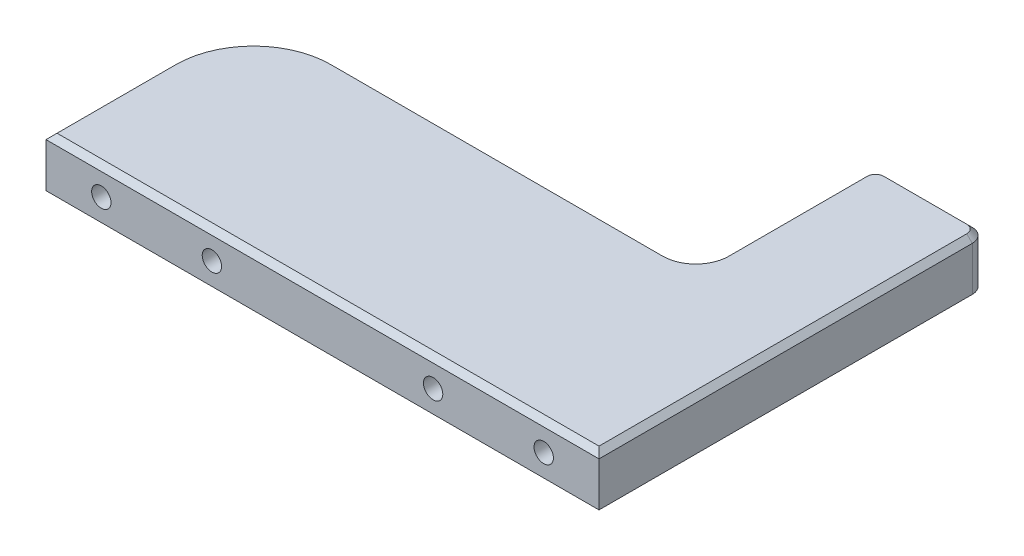
ISO-10303-21;
HEADER;
FILE_DESCRIPTION(('STEP AP214'),'2;1');
FILE_NAME('part.step','',(''),(''),'','','');
FILE_SCHEMA(('AUTOMOTIVE_DESIGN { 1 0 10303 214 1 1 1 1 }'));
ENDSEC;
DATA;
#1=APPLICATION_CONTEXT('core data for automotive mechanical design processes');
#2=APPLICATION_PROTOCOL_DEFINITION('international standard','automotive_design',2000,#1);
#3=PRODUCT_CONTEXT('',#1,'mechanical');
#4=PRODUCT('Part','Part','',(#3));
#5=PRODUCT_RELATED_PRODUCT_CATEGORY('part','',(#4));
#6=PRODUCT_DEFINITION_FORMATION('','',#4);
#7=PRODUCT_DEFINITION_CONTEXT('part definition',#1,'design');
#8=PRODUCT_DEFINITION('design','',#6,#7);
#9=PRODUCT_DEFINITION_SHAPE('','',#8);
#10=(LENGTH_UNIT() NAMED_UNIT(*) SI_UNIT(.MILLI.,.METRE.));
#11=(NAMED_UNIT(*) PLANE_ANGLE_UNIT() SI_UNIT($,.RADIAN.));
#12=(NAMED_UNIT(*) SI_UNIT($,.STERADIAN.) SOLID_ANGLE_UNIT());
#13=UNCERTAINTY_MEASURE_WITH_UNIT(LENGTH_MEASURE(1.E-05),#10,'distance_accuracy_value','');
#14=(GEOMETRIC_REPRESENTATION_CONTEXT(3) GLOBAL_UNCERTAINTY_ASSIGNED_CONTEXT((#13)) GLOBAL_UNIT_ASSIGNED_CONTEXT((#10,
#11,#12)) REPRESENTATION_CONTEXT('',''));
#15=CARTESIAN_POINT('',(0.,0.,0.));
#16=DIRECTION('',(0.,0.,1.));
#17=DIRECTION('',(1.,0.,0.));
#18=AXIS2_PLACEMENT_3D('',#15,#16,#17);
#19=CARTESIAN_POINT('',(0.,20.,0.));
#20=DIRECTION('',(0.,0.,1.));
#21=DIRECTION('',(1.,0.,0.));
#22=AXIS2_PLACEMENT_3D('',#19,#20,#21);
#23=PLANE('',#22);
#24=DIRECTION('',(0.,-1.,0.));
#25=VECTOR('',#24,1.);
#26=CARTESIAN_POINT('',(-5.,20.,0.));
#27=LINE('',#26,#25);
#28=CARTESIAN_POINT('',(-5.,18.,0.));
#29=VERTEX_POINT('',#28);
#30=CARTESIAN_POINT('',(-5.,2.,0.));
#31=VERTEX_POINT('',#30);
#32=EDGE_CURVE('E359',#29,#31,#27,.T.);
#33=ORIENTED_EDGE('',*,*,#32,.T.);
#34=DIRECTION('',(-1.,0.,0.));
#35=VECTOR('',#34,1.);
#36=CARTESIAN_POINT('',(0.,2.,0.));
#37=LINE('',#36,#35);
#38=CARTESIAN_POINT('',(-35.,2.,0.));
#39=VERTEX_POINT('',#38);
#40=EDGE_CURVE('E255',#31,#39,#37,.T.);
#41=ORIENTED_EDGE('',*,*,#40,.T.);
#42=DIRECTION('',(0.,-1.,0.));
#43=VECTOR('',#42,1.);
#44=CARTESIAN_POINT('',(-35.,20.,0.));
#45=LINE('',#44,#43);
#46=CARTESIAN_POINT('',(-35.,18.,0.));
#47=VERTEX_POINT('',#46);
#48=EDGE_CURVE('E362',#39,#47,#45,.F.);
#49=ORIENTED_EDGE('',*,*,#48,.T.);
#50=DIRECTION('',(1.,0.,0.));
#51=VECTOR('',#50,1.);
#52=CARTESIAN_POINT('',(-5.,18.,0.));
#53=LINE('',#52,#51);
#54=EDGE_CURVE('E253',#47,#29,#53,.T.);
#55=ORIENTED_EDGE('',*,*,#54,.T.);
#56=EDGE_LOOP('',(#33,#41,#49,#55));
#57=FACE_BOUND('',#56,.T.);
#58=ADVANCED_FACE('F44',(#57),#23,.F.);
#59=CARTESIAN_POINT('',(-40.,20.,0.));
#60=DIRECTION('',(1.,0.,0.));
#61=DIRECTION('',(0.,0.,-1.));
#62=AXIS2_PLACEMENT_3D('',#59,#60,#61);
#63=PLANE('',#62);
#64=DIRECTION('',(0.,-1.,0.));
#65=VECTOR('',#64,1.);
#66=CARTESIAN_POINT('',(-40.,20.,5.00000000000001));
#67=LINE('',#66,#65);
#68=CARTESIAN_POINT('',(-40.,18.,5.00000000000001));
#69=VERTEX_POINT('',#68);
#70=CARTESIAN_POINT('',(-40.,2.,5.00000000000001));
#71=VERTEX_POINT('',#70);
#72=EDGE_CURVE('E364',#69,#71,#67,.T.);
#73=ORIENTED_EDGE('',*,*,#72,.T.);
#74=DIRECTION('',(0.,0.,1.));
#75=VECTOR('',#74,1.);
#76=CARTESIAN_POINT('',(-40.,2.,0.));
#77=LINE('',#76,#75);
#78=CARTESIAN_POINT('',(-40.,2.,55.));
#79=VERTEX_POINT('',#78);
#80=EDGE_CURVE('E263',#71,#79,#77,.T.);
#81=ORIENTED_EDGE('',*,*,#80,.T.);
#82=DIRECTION('',(0.,-1.,0.));
#83=VECTOR('',#82,1.);
#84=CARTESIAN_POINT('',(-40.,20.,55.));
#85=LINE('',#84,#83);
#86=CARTESIAN_POINT('',(-40.,18.,55.));
#87=VERTEX_POINT('',#86);
#88=EDGE_CURVE('E367',#79,#87,#85,.F.);
#89=ORIENTED_EDGE('',*,*,#88,.T.);
#90=DIRECTION('',(0.,0.,-1.));
#91=VECTOR('',#90,1.);
#92=CARTESIAN_POINT('',(-40.,18.,5.00000000000001));
#93=LINE('',#92,#91);
#94=EDGE_CURVE('E261',#87,#69,#93,.T.);
#95=ORIENTED_EDGE('',*,*,#94,.T.);
#96=EDGE_LOOP('',(#73,#81,#89,#95));
#97=FACE_BOUND('',#96,.T.);
#98=ADVANCED_FACE('F424',(#97),#63,.F.);
#99=CARTESIAN_POINT('',(-40.,20.,65.));
#100=DIRECTION('',(0.,0.,1.));
#101=DIRECTION('',(1.,0.,0.));
#102=AXIS2_PLACEMENT_3D('',#99,#100,#101);
#103=PLANE('',#102);
#104=DIRECTION('',(0.,-1.,0.));
#105=VECTOR('',#104,1.);
#106=CARTESIAN_POINT('',(-50.,0.,65.));
#107=LINE('',#106,#105);
#108=CARTESIAN_POINT('',(-50.,18.,65.));
#109=VERTEX_POINT('',#108);
#110=CARTESIAN_POINT('',(-50.,2.,65.));
#111=VERTEX_POINT('',#110);
#112=EDGE_CURVE('E430',#109,#111,#107,.T.);
#113=ORIENTED_EDGE('',*,*,#112,.T.);
#114=DIRECTION('',(-1.,0.,0.));
#115=VECTOR('',#114,1.);
#116=CARTESIAN_POINT('',(-40.,2.,65.));
#117=LINE('',#116,#115);
#118=CARTESIAN_POINT('',(-170.,2.,65.));
#119=VERTEX_POINT('',#118);
#120=EDGE_CURVE('E272',#111,#119,#117,.T.);
#121=ORIENTED_EDGE('',*,*,#120,.T.);
#122=DIRECTION('',(0.,-1.,0.));
#123=VECTOR('',#122,1.);
#124=CARTESIAN_POINT('',(-170.,20.,65.));
#125=LINE('',#124,#123);
#126=CARTESIAN_POINT('',(-170.,18.,65.));
#127=VERTEX_POINT('',#126);
#128=EDGE_CURVE('E220',#119,#127,#125,.F.);
#129=ORIENTED_EDGE('',*,*,#128,.T.);
#130=DIRECTION('',(1.,0.,0.));
#131=VECTOR('',#130,1.);
#132=CARTESIAN_POINT('',(-50.,18.,65.));
#133=LINE('',#132,#131);
#134=EDGE_CURVE('E270',#127,#109,#133,.T.);
#135=ORIENTED_EDGE('',*,*,#134,.T.);
#136=EDGE_LOOP('',(#113,#121,#129,#135));
#137=FACE_BOUND('',#136,.T.);
#138=ADVANCED_FACE('F489',(#137),#103,.F.);
#139=CARTESIAN_POINT('',(-200.,20.,65.));
#140=DIRECTION('',(1.,0.,0.));
#141=DIRECTION('',(0.,0.,-1.));
#142=AXIS2_PLACEMENT_3D('',#139,#140,#141);
#143=PLANE('',#142);
#144=DIRECTION('',(0.,-1.,0.));
#145=VECTOR('',#144,1.);
#146=CARTESIAN_POINT('',(-200.,20.,95.));
#147=LINE('',#146,#145);
#148=CARTESIAN_POINT('',(-200.,18.,95.));
#149=VERTEX_POINT('',#148);
#150=CARTESIAN_POINT('',(-200.,2.,95.));
#151=VERTEX_POINT('',#150);
#152=EDGE_CURVE('E225',#149,#151,#147,.T.);
#153=ORIENTED_EDGE('',*,*,#152,.T.);
#154=DIRECTION('',(0.,0.,1.));
#155=VECTOR('',#154,1.);
#156=CARTESIAN_POINT('',(-200.,2.,65.));
#157=LINE('',#156,#155);
#158=CARTESIAN_POINT('',(-200.,2.,140.));
#159=VERTEX_POINT('',#158);
#160=EDGE_CURVE('E280',#151,#159,#157,.T.);
#161=ORIENTED_EDGE('',*,*,#160,.T.);
#162=DIRECTION('',(0.,-1.,0.));
#163=VECTOR('',#162,1.);
#164=CARTESIAN_POINT('',(-200.,20.,140.));
#165=LINE('',#164,#163);
#166=CARTESIAN_POINT('',(-200.,18.,140.));
#167=VERTEX_POINT('',#166);
#168=EDGE_CURVE('E205',#167,#159,#165,.T.);
#169=ORIENTED_EDGE('',*,*,#168,.F.);
#170=DIRECTION('',(0.,0.,-1.));
#171=VECTOR('',#170,1.);
#172=CARTESIAN_POINT('',(-200.,18.,95.));
#173=LINE('',#172,#171);
#174=EDGE_CURVE('E278',#167,#149,#173,.T.);
#175=ORIENTED_EDGE('',*,*,#174,.T.);
#176=EDGE_LOOP('',(#153,#161,#169,#175));
#177=FACE_BOUND('',#176,.T.);
#178=ADVANCED_FACE('F376',(#177),#143,.F.);
#179=CARTESIAN_POINT('',(-200.,20.,140.));
#180=DIRECTION('',(0.,0.,-1.));
#181=DIRECTION('',(-1.,0.,0.));
#182=AXIS2_PLACEMENT_3D('',#179,#180,#181);
#183=PLANE('',#182);
#184=CARTESIAN_POINT('',(-179.999999999914,10.0000000000008,140.));
#185=DIRECTION('',(0.,0.,1.));
#186=DIRECTION('',(1.,0.,0.));
#187=AXIS2_PLACEMENT_3D('',#184,#185,#186);
#188=CIRCLE('',#187,3.49999999999998);
#189=CARTESIAN_POINT('',(-176.499999999914,10.0000000000008,140.));
#190=VERTEX_POINT('',#189);
#191=EDGE_CURVE('E325',#190,#190,#188,.T.);
#192=ORIENTED_EDGE('',*,*,#191,.F.);
#193=EDGE_LOOP('',(#192));
#194=FACE_BOUND('',#193,.T.);
#195=CARTESIAN_POINT('',(-139.999999999914,10.0000000000008,140.));
#196=DIRECTION('',(0.,0.,1.));
#197=DIRECTION('',(1.,0.,0.));
#198=AXIS2_PLACEMENT_3D('',#195,#196,#197);
#199=CIRCLE('',#198,3.49999999999998);
#200=CARTESIAN_POINT('',(-136.499999999914,10.0000000000008,140.));
#201=VERTEX_POINT('',#200);
#202=EDGE_CURVE('E448',#201,#201,#199,.T.);
#203=ORIENTED_EDGE('',*,*,#202,.F.);
#204=EDGE_LOOP('',(#203));
#205=FACE_BOUND('',#204,.T.);
#206=CARTESIAN_POINT('',(-59.9999999999135,10.0000000000008,140.));
#207=DIRECTION('',(0.,0.,1.));
#208=DIRECTION('',(1.,0.,0.));
#209=AXIS2_PLACEMENT_3D('',#206,#207,#208);
#210=CIRCLE('',#209,3.49999999999999);
#211=CARTESIAN_POINT('',(-56.4999999999135,10.0000000000008,140.));
#212=VERTEX_POINT('',#211);
#213=EDGE_CURVE('E442',#212,#212,#210,.T.);
#214=ORIENTED_EDGE('',*,*,#213,.F.);
#215=EDGE_LOOP('',(#214));
#216=FACE_BOUND('',#215,.T.);
#217=CARTESIAN_POINT('',(-19.9999999999143,10.0000000000008,140.));
#218=DIRECTION('',(0.,0.,1.));
#219=DIRECTION('',(1.,0.,0.));
#220=AXIS2_PLACEMENT_3D('',#217,#218,#219);
#221=CIRCLE('',#220,3.49999999999999);
#222=CARTESIAN_POINT('',(-16.4999999999143,10.0000000000008,140.));
#223=VERTEX_POINT('',#222);
#224=EDGE_CURVE('E436',#223,#223,#221,.T.);
#225=ORIENTED_EDGE('',*,*,#224,.F.);
#226=EDGE_LOOP('',(#225));
#227=FACE_BOUND('',#226,.T.);
#228=ORIENTED_EDGE('',*,*,#168,.T.);
#229=DIRECTION('',(1.,0.,0.));
#230=VECTOR('',#229,1.);
#231=CARTESIAN_POINT('',(-200.,2.,140.));
#232=LINE('',#231,#230);
#233=CARTESIAN_POINT('',(0.,2.,140.));
#234=VERTEX_POINT('',#233);
#235=EDGE_CURVE('E204',#159,#234,#232,.T.);
#236=ORIENTED_EDGE('',*,*,#235,.T.);
#237=DIRECTION('',(0.,-1.,0.));
#238=VECTOR('',#237,1.);
#239=CARTESIAN_POINT('',(0.,20.,140.));
#240=LINE('',#239,#238);
#241=CARTESIAN_POINT('',(0.,18.,140.));
#242=VERTEX_POINT('',#241);
#243=EDGE_CURVE('E186',#242,#234,#240,.T.);
#244=ORIENTED_EDGE('',*,*,#243,.F.);
#245=DIRECTION('',(-1.,0.,0.));
#246=VECTOR('',#245,1.);
#247=CARTESIAN_POINT('',(-200.,18.,140.));
#248=LINE('',#247,#246);
#249=EDGE_CURVE('E201',#242,#167,#248,.T.);
#250=ORIENTED_EDGE('',*,*,#249,.T.);
#251=EDGE_LOOP('',(#228,#236,#244,#250));
#252=FACE_BOUND('',#251,.T.);
#253=ADVANCED_FACE('F199',(#194,#205,#216,#227,#252),#183,.F.);
#254=CARTESIAN_POINT('',(0.,20.,0.));
#255=DIRECTION('',(-1.,0.,0.));
#256=DIRECTION('',(0.,0.,1.));
#257=AXIS2_PLACEMENT_3D('',#254,#255,#256);
#258=PLANE('',#257);
#259=ORIENTED_EDGE('',*,*,#243,.T.);
#260=DIRECTION('',(0.,0.,-1.));
#261=VECTOR('',#260,1.);
#262=CARTESIAN_POINT('',(0.,2.,0.));
#263=LINE('',#262,#261);
#264=CARTESIAN_POINT('',(0.,2.,5.));
#265=VERTEX_POINT('',#264);
#266=EDGE_CURVE('E193',#234,#265,#263,.T.);
#267=ORIENTED_EDGE('',*,*,#266,.T.);
#268=DIRECTION('',(0.,-1.,0.));
#269=VECTOR('',#268,1.);
#270=CARTESIAN_POINT('',(0.,20.,5.));
#271=LINE('',#270,#269);
#272=CARTESIAN_POINT('',(0.,18.,5.));
#273=VERTEX_POINT('',#272);
#274=EDGE_CURVE('E188',#265,#273,#271,.F.);
#275=ORIENTED_EDGE('',*,*,#274,.T.);
#276=DIRECTION('',(0.,0.,1.));
#277=VECTOR('',#276,1.);
#278=CARTESIAN_POINT('',(0.,18.,140.));
#279=LINE('',#278,#277);
#280=EDGE_CURVE('E183',#273,#242,#279,.T.);
#281=ORIENTED_EDGE('',*,*,#280,.T.);
#282=EDGE_LOOP('',(#259,#267,#275,#281));
#283=FACE_BOUND('',#282,.T.);
#284=ADVANCED_FACE('F185',(#283),#258,.F.);
#285=CARTESIAN_POINT('',(0.,20.,0.));
#286=DIRECTION('',(0.,1.,0.));
#287=DIRECTION('',(0.,0.,1.));
#288=AXIS2_PLACEMENT_3D('',#285,#286,#287);
#289=PLANE('',#288);
#290=DIRECTION('',(0.,0.,1.));
#291=VECTOR('',#290,1.);
#292=CARTESIAN_POINT('',(-38.,20.,55.));
#293=LINE('',#292,#291);
#294=CARTESIAN_POINT('',(-38.,20.,5.00000000000001));
#295=VERTEX_POINT('',#294);
#296=CARTESIAN_POINT('',(-38.,20.,55.));
#297=VERTEX_POINT('',#296);
#298=EDGE_CURVE('E54',#295,#297,#293,.T.);
#299=ORIENTED_EDGE('',*,*,#298,.T.);
#300=CARTESIAN_POINT('',(-50.,20.,55.));
#301=DIRECTION('',(0.,1.,0.));
#302=DIRECTION('',(0.,0.,1.));
#303=AXIS2_PLACEMENT_3D('',#300,#301,#302);
#304=CIRCLE('',#303,12.);
#305=CARTESIAN_POINT('',(-50.,20.,67.));
#306=VERTEX_POINT('',#305);
#307=EDGE_CURVE('E13',#297,#306,#304,.F.);
#308=ORIENTED_EDGE('',*,*,#307,.T.);
#309=DIRECTION('',(-1.,0.,0.));
#310=VECTOR('',#309,1.);
#311=CARTESIAN_POINT('',(-170.,20.,67.));
#312=LINE('',#311,#310);
#313=CARTESIAN_POINT('',(-170.,20.,67.));
#314=VERTEX_POINT('',#313);
#315=EDGE_CURVE('E282',#306,#314,#312,.T.);
#316=ORIENTED_EDGE('',*,*,#315,.T.);
#317=CARTESIAN_POINT('',(-170.,20.,95.));
#318=DIRECTION('',(0.,1.,0.));
#319=DIRECTION('',(0.,0.,1.));
#320=AXIS2_PLACEMENT_3D('',#317,#318,#319);
#321=CIRCLE('',#320,28.);
#322=CARTESIAN_POINT('',(-198.,20.,95.));
#323=VERTEX_POINT('',#322);
#324=EDGE_CURVE('E284',#314,#323,#321,.T.);
#325=ORIENTED_EDGE('',*,*,#324,.T.);
#326=DIRECTION('',(0.,0.,1.));
#327=VECTOR('',#326,1.);
#328=CARTESIAN_POINT('',(-198.,20.,140.));
#329=LINE('',#328,#327);
#330=CARTESIAN_POINT('',(-198.,20.,138.));
#331=VERTEX_POINT('',#330);
#332=EDGE_CURVE('E286',#323,#331,#329,.T.);
#333=ORIENTED_EDGE('',*,*,#332,.T.);
#334=DIRECTION('',(1.,0.,0.));
#335=VECTOR('',#334,1.);
#336=CARTESIAN_POINT('',(0.,20.,138.));
#337=LINE('',#336,#335);
#338=CARTESIAN_POINT('',(-1.99999999999998,20.,138.));
#339=VERTEX_POINT('',#338);
#340=EDGE_CURVE('E288',#331,#339,#337,.T.);
#341=ORIENTED_EDGE('',*,*,#340,.T.);
#342=DIRECTION('',(0.,0.,-1.));
#343=VECTOR('',#342,1.);
#344=CARTESIAN_POINT('',(-2.,20.,5.));
#345=LINE('',#344,#343);
#346=CARTESIAN_POINT('',(-2.,20.,5.));
#347=VERTEX_POINT('',#346);
#348=EDGE_CURVE('E211',#339,#347,#345,.T.);
#349=ORIENTED_EDGE('',*,*,#348,.T.);
#350=CARTESIAN_POINT('',(-5.,20.,5.));
#351=DIRECTION('',(0.,1.,0.));
#352=DIRECTION('',(0.,0.,1.));
#353=AXIS2_PLACEMENT_3D('',#350,#351,#352);
#354=CIRCLE('',#353,3.);
#355=CARTESIAN_POINT('',(-5.,20.,2.));
#356=VERTEX_POINT('',#355);
#357=EDGE_CURVE('E291',#347,#356,#354,.T.);
#358=ORIENTED_EDGE('',*,*,#357,.T.);
#359=DIRECTION('',(-1.,0.,0.));
#360=VECTOR('',#359,1.);
#361=CARTESIAN_POINT('',(-35.,20.,2.));
#362=LINE('',#361,#360);
#363=CARTESIAN_POINT('',(-35.,20.,2.));
#364=VERTEX_POINT('',#363);
#365=EDGE_CURVE('E293',#356,#364,#362,.T.);
#366=ORIENTED_EDGE('',*,*,#365,.T.);
#367=CARTESIAN_POINT('',(-35.,20.,5.));
#368=DIRECTION('',(0.,1.,0.));
#369=DIRECTION('',(0.,0.,1.));
#370=AXIS2_PLACEMENT_3D('',#367,#368,#369);
#371=CIRCLE('',#370,3.);
#372=EDGE_CURVE('E65',#364,#295,#371,.T.);
#373=ORIENTED_EDGE('',*,*,#372,.T.);
#374=EDGE_LOOP('',(#299,#308,#316,#325,#333,#341,#349,#358,#366,#373));
#375=FACE_BOUND('',#374,.T.);
#376=ADVANCED_FACE('F733',(#375),#289,.T.);
#377=CARTESIAN_POINT('',(0.,0.,0.));
#378=DIRECTION('',(0.,1.,0.));
#379=DIRECTION('',(0.,0.,1.));
#380=AXIS2_PLACEMENT_3D('',#377,#378,#379);
#381=PLANE('',#380);
#382=DIRECTION('',(0.,0.,1.));
#383=VECTOR('',#382,1.);
#384=CARTESIAN_POINT('',(-2.,0.,0.));
#385=LINE('',#384,#383);
#386=CARTESIAN_POINT('',(-2.,0.,5.));
#387=VERTEX_POINT('',#386);
#388=CARTESIAN_POINT('',(-1.99999999999998,0.,138.));
#389=VERTEX_POINT('',#388);
#390=EDGE_CURVE('E244',#387,#389,#385,.T.);
#391=ORIENTED_EDGE('',*,*,#390,.T.);
#392=DIRECTION('',(-1.,0.,0.));
#393=VECTOR('',#392,1.);
#394=CARTESIAN_POINT('',(0.,0.,138.));
#395=LINE('',#394,#393);
#396=CARTESIAN_POINT('',(-198.,0.,138.));
#397=VERTEX_POINT('',#396);
#398=EDGE_CURVE('E194',#389,#397,#395,.T.);
#399=ORIENTED_EDGE('',*,*,#398,.T.);
#400=DIRECTION('',(0.,0.,-1.));
#401=VECTOR('',#400,1.);
#402=CARTESIAN_POINT('',(-198.,0.,0.));
#403=LINE('',#402,#401);
#404=CARTESIAN_POINT('',(-198.,0.,95.));
#405=VERTEX_POINT('',#404);
#406=EDGE_CURVE('E222',#397,#405,#403,.T.);
#407=ORIENTED_EDGE('',*,*,#406,.T.);
#408=CARTESIAN_POINT('',(-170.,0.,95.));
#409=DIRECTION('',(0.,1.,0.));
#410=DIRECTION('',(0.,0.,1.));
#411=AXIS2_PLACEMENT_3D('',#408,#409,#410);
#412=CIRCLE('',#411,28.);
#413=CARTESIAN_POINT('',(-170.,0.,67.));
#414=VERTEX_POINT('',#413);
#415=EDGE_CURVE('E230',#405,#414,#412,.F.);
#416=ORIENTED_EDGE('',*,*,#415,.T.);
#417=DIRECTION('',(1.,0.,0.));
#418=VECTOR('',#417,1.);
#419=CARTESIAN_POINT('',(0.,0.,67.));
#420=LINE('',#419,#418);
#421=CARTESIAN_POINT('',(-50.,0.,67.));
#422=VERTEX_POINT('',#421);
#423=EDGE_CURVE('E232',#414,#422,#420,.T.);
#424=ORIENTED_EDGE('',*,*,#423,.T.);
#425=CARTESIAN_POINT('',(-50.,0.,55.));
#426=DIRECTION('',(0.,1.,0.));
#427=DIRECTION('',(0.,0.,1.));
#428=AXIS2_PLACEMENT_3D('',#425,#426,#427);
#429=CIRCLE('',#428,12.);
#430=CARTESIAN_POINT('',(-38.,0.,55.));
#431=VERTEX_POINT('',#430);
#432=EDGE_CURVE('E234',#422,#431,#429,.T.);
#433=ORIENTED_EDGE('',*,*,#432,.T.);
#434=DIRECTION('',(0.,0.,-1.));
#435=VECTOR('',#434,1.);
#436=CARTESIAN_POINT('',(-38.,0.,0.));
#437=LINE('',#436,#435);
#438=CARTESIAN_POINT('',(-38.,0.,5.00000000000001));
#439=VERTEX_POINT('',#438);
#440=EDGE_CURVE('E236',#431,#439,#437,.T.);
#441=ORIENTED_EDGE('',*,*,#440,.T.);
#442=CARTESIAN_POINT('',(-35.,0.,5.));
#443=DIRECTION('',(0.,1.,0.));
#444=DIRECTION('',(0.,0.,1.));
#445=AXIS2_PLACEMENT_3D('',#442,#443,#444);
#446=CIRCLE('',#445,3.);
#447=CARTESIAN_POINT('',(-35.,0.,2.));
#448=VERTEX_POINT('',#447);
#449=EDGE_CURVE('E238',#439,#448,#446,.F.);
#450=ORIENTED_EDGE('',*,*,#449,.T.);
#451=DIRECTION('',(1.,0.,0.));
#452=VECTOR('',#451,1.);
#453=CARTESIAN_POINT('',(0.,0.,2.));
#454=LINE('',#453,#452);
#455=CARTESIAN_POINT('',(-5.,0.,2.));
#456=VERTEX_POINT('',#455);
#457=EDGE_CURVE('E240',#448,#456,#454,.T.);
#458=ORIENTED_EDGE('',*,*,#457,.T.);
#459=CARTESIAN_POINT('',(-5.,0.,5.));
#460=DIRECTION('',(0.,1.,0.));
#461=DIRECTION('',(0.,0.,1.));
#462=AXIS2_PLACEMENT_3D('',#459,#460,#461);
#463=CIRCLE('',#462,3.);
#464=EDGE_CURVE('E242',#456,#387,#463,.F.);
#465=ORIENTED_EDGE('',*,*,#464,.T.);
#466=EDGE_LOOP('',(#391,#399,#407,#416,#424,#433,#441,#450,#458,#465));
#467=FACE_BOUND('',#466,.T.);
#468=ADVANCED_FACE('F495',(#467),#381,.F.);
#469=CARTESIAN_POINT('',(-50.,20.,55.));
#470=DIRECTION('',(0.,1.,0.));
#471=DIRECTION('',(0.,0.,1.));
#472=AXIS2_PLACEMENT_3D('',#469,#470,#471);
#473=CYLINDRICAL_SURFACE('',#472,10.);
#474=ORIENTED_EDGE('',*,*,#88,.F.);
#475=CARTESIAN_POINT('',(-50.,2.,55.));
#476=DIRECTION('',(0.,1.,0.));
#477=DIRECTION('',(0.,0.,1.));
#478=AXIS2_PLACEMENT_3D('',#475,#476,#477);
#479=CIRCLE('',#478,10.);
#480=EDGE_CURVE('E268',#79,#111,#479,.F.);
#481=ORIENTED_EDGE('',*,*,#480,.T.);
#482=ORIENTED_EDGE('',*,*,#112,.F.);
#483=CARTESIAN_POINT('',(-50.,18.,55.));
#484=DIRECTION('',(0.,1.,0.));
#485=DIRECTION('',(0.,0.,1.));
#486=AXIS2_PLACEMENT_3D('',#483,#484,#485);
#487=CIRCLE('',#486,10.);
#488=EDGE_CURVE('E265',#109,#87,#487,.T.);
#489=ORIENTED_EDGE('',*,*,#488,.T.);
#490=EDGE_LOOP('',(#474,#481,#482,#489));
#491=FACE_BOUND('',#490,.T.);
#492=ADVANCED_FACE('F426',(#491),#473,.F.);
#493=CARTESIAN_POINT('',(-19.9999999999143,10.0000000000008,100.));
#494=DIRECTION('',(0.,0.,-1.));
#495=DIRECTION('',(-1.,0.,0.));
#496=AXIS2_PLACEMENT_3D('',#493,#494,#495);
#497=PLANE('',#496);
#498=CARTESIAN_POINT('',(-19.9999999999143,10.0000000000008,100.));
#499=DIRECTION('',(0.,0.,1.));
#500=DIRECTION('',(1.,0.,0.));
#501=AXIS2_PLACEMENT_3D('',#498,#499,#500);
#502=CIRCLE('',#501,3.49999999999998);
#503=CARTESIAN_POINT('',(-16.4999999999143,10.0000000000008,100.));
#504=VERTEX_POINT('',#503);
#505=EDGE_CURVE('E206',#504,#504,#502,.T.);
#506=ORIENTED_EDGE('',*,*,#505,.T.);
#507=EDGE_LOOP('',(#506));
#508=FACE_BOUND('',#507,.T.);
#509=ADVANCED_FACE('F471',(#508),#497,.F.);
#510=CARTESIAN_POINT('',(-19.9999999999143,10.0000000000008,140.));
#511=DIRECTION('',(0.,0.,1.));
#512=DIRECTION('',(1.,0.,0.));
#513=AXIS2_PLACEMENT_3D('',#510,#511,#512);
#514=CYLINDRICAL_SURFACE('',#513,3.49999999999999);
#515=ORIENTED_EDGE('',*,*,#505,.F.);
#516=EDGE_LOOP('',(#515));
#517=FACE_BOUND('',#516,.T.);
#518=ORIENTED_EDGE('',*,*,#224,.T.);
#519=EDGE_LOOP('',(#518));
#520=FACE_BOUND('',#519,.T.);
#521=ADVANCED_FACE('F468',(#517,#520),#514,.F.);
#522=CARTESIAN_POINT('',(-59.9999999999135,10.0000000000008,100.));
#523=DIRECTION('',(0.,0.,-1.));
#524=DIRECTION('',(-1.,0.,0.));
#525=AXIS2_PLACEMENT_3D('',#522,#523,#524);
#526=PLANE('',#525);
#527=CARTESIAN_POINT('',(-59.9999999999135,10.0000000000008,100.));
#528=DIRECTION('',(0.,0.,1.));
#529=DIRECTION('',(1.,0.,0.));
#530=AXIS2_PLACEMENT_3D('',#527,#528,#529);
#531=CIRCLE('',#530,3.49999999999998);
#532=CARTESIAN_POINT('',(-56.4999999999135,10.0000000000008,100.));
#533=VERTEX_POINT('',#532);
#534=EDGE_CURVE('E439',#533,#533,#531,.T.);
#535=ORIENTED_EDGE('',*,*,#534,.T.);
#536=EDGE_LOOP('',(#535));
#537=FACE_BOUND('',#536,.T.);
#538=ADVANCED_FACE('F470',(#537),#526,.F.);
#539=CARTESIAN_POINT('',(-59.9999999999135,10.0000000000008,140.));
#540=DIRECTION('',(0.,0.,1.));
#541=DIRECTION('',(1.,0.,0.));
#542=AXIS2_PLACEMENT_3D('',#539,#540,#541);
#543=CYLINDRICAL_SURFACE('',#542,3.49999999999999);
#544=ORIENTED_EDGE('',*,*,#534,.F.);
#545=EDGE_LOOP('',(#544));
#546=FACE_BOUND('',#545,.T.);
#547=ORIENTED_EDGE('',*,*,#213,.T.);
#548=EDGE_LOOP('',(#547));
#549=FACE_BOUND('',#548,.T.);
#550=ADVANCED_FACE('F478',(#546,#549),#543,.F.);
#551=CARTESIAN_POINT('',(-139.999999999914,10.0000000000008,100.));
#552=DIRECTION('',(0.,0.,-1.));
#553=DIRECTION('',(-1.,0.,0.));
#554=AXIS2_PLACEMENT_3D('',#551,#552,#553);
#555=PLANE('',#554);
#556=CARTESIAN_POINT('',(-139.999999999914,10.0000000000008,100.));
#557=DIRECTION('',(0.,0.,1.));
#558=DIRECTION('',(1.,0.,0.));
#559=AXIS2_PLACEMENT_3D('',#556,#557,#558);
#560=CIRCLE('',#559,3.49999999999998);
#561=CARTESIAN_POINT('',(-136.499999999914,10.0000000000008,100.));
#562=VERTEX_POINT('',#561);
#563=EDGE_CURVE('E445',#562,#562,#560,.T.);
#564=ORIENTED_EDGE('',*,*,#563,.T.);
#565=EDGE_LOOP('',(#564));
#566=FACE_BOUND('',#565,.T.);
#567=ADVANCED_FACE('F692',(#566),#555,.F.);
#568=CARTESIAN_POINT('',(-139.999999999914,10.0000000000008,140.));
#569=DIRECTION('',(0.,0.,1.));
#570=DIRECTION('',(1.,0.,0.));
#571=AXIS2_PLACEMENT_3D('',#568,#569,#570);
#572=CYLINDRICAL_SURFACE('',#571,3.49999999999998);
#573=ORIENTED_EDGE('',*,*,#563,.F.);
#574=EDGE_LOOP('',(#573));
#575=FACE_BOUND('',#574,.T.);
#576=ORIENTED_EDGE('',*,*,#202,.T.);
#577=EDGE_LOOP('',(#576));
#578=FACE_BOUND('',#577,.T.);
#579=ADVANCED_FACE('F684',(#575,#578),#572,.F.);
#580=CARTESIAN_POINT('',(-179.999999999914,10.0000000000008,100.));
#581=DIRECTION('',(0.,0.,-1.));
#582=DIRECTION('',(-1.,0.,0.));
#583=AXIS2_PLACEMENT_3D('',#580,#581,#582);
#584=PLANE('',#583);
#585=CARTESIAN_POINT('',(-179.999999999914,10.0000000000008,100.));
#586=DIRECTION('',(0.,0.,1.));
#587=DIRECTION('',(1.,0.,0.));
#588=AXIS2_PLACEMENT_3D('',#585,#586,#587);
#589=CIRCLE('',#588,3.49999999999998);
#590=CARTESIAN_POINT('',(-176.499999999914,10.0000000000008,100.));
#591=VERTEX_POINT('',#590);
#592=EDGE_CURVE('E451',#591,#591,#589,.T.);
#593=ORIENTED_EDGE('',*,*,#592,.T.);
#594=EDGE_LOOP('',(#593));
#595=FACE_BOUND('',#594,.T.);
#596=ADVANCED_FACE('F676',(#595),#584,.F.);
#597=CARTESIAN_POINT('',(-179.999999999914,10.0000000000008,140.));
#598=DIRECTION('',(0.,0.,1.));
#599=DIRECTION('',(1.,0.,0.));
#600=AXIS2_PLACEMENT_3D('',#597,#598,#599);
#601=CYLINDRICAL_SURFACE('',#600,3.49999999999998);
#602=ORIENTED_EDGE('',*,*,#592,.F.);
#603=EDGE_LOOP('',(#602));
#604=FACE_BOUND('',#603,.T.);
#605=ORIENTED_EDGE('',*,*,#191,.T.);
#606=EDGE_LOOP('',(#605));
#607=FACE_BOUND('',#606,.T.);
#608=ADVANCED_FACE('F457',(#604,#607),#601,.F.);
#609=CARTESIAN_POINT('',(-5.,20.,5.));
#610=DIRECTION('',(0.,-1.,0.));
#611=DIRECTION('',(0.,0.,-1.));
#612=AXIS2_PLACEMENT_3D('',#609,#610,#611);
#613=CYLINDRICAL_SURFACE('',#612,5.);
#614=ORIENTED_EDGE('',*,*,#274,.F.);
#615=CARTESIAN_POINT('',(-5.,2.,5.));
#616=DIRECTION('',(0.,1.,0.));
#617=DIRECTION('',(0.,0.,1.));
#618=AXIS2_PLACEMENT_3D('',#615,#616,#617);
#619=CIRCLE('',#618,5.);
#620=EDGE_CURVE('E251',#265,#31,#619,.T.);
#621=ORIENTED_EDGE('',*,*,#620,.T.);
#622=ORIENTED_EDGE('',*,*,#32,.F.);
#623=CARTESIAN_POINT('',(-5.,18.,5.));
#624=DIRECTION('',(0.,1.,0.));
#625=DIRECTION('',(0.,0.,1.));
#626=AXIS2_PLACEMENT_3D('',#623,#624,#625);
#627=CIRCLE('',#626,5.);
#628=EDGE_CURVE('E249',#29,#273,#627,.F.);
#629=ORIENTED_EDGE('',*,*,#628,.T.);
#630=EDGE_LOOP('',(#614,#621,#622,#629));
#631=FACE_BOUND('',#630,.T.);
#632=ADVANCED_FACE('F356',(#631),#613,.T.);
#633=CARTESIAN_POINT('',(-35.,20.,5.));
#634=DIRECTION('',(0.,-1.,0.));
#635=DIRECTION('',(0.,0.,-1.));
#636=AXIS2_PLACEMENT_3D('',#633,#634,#635);
#637=CYLINDRICAL_SURFACE('',#636,5.);
#638=ORIENTED_EDGE('',*,*,#48,.F.);
#639=CARTESIAN_POINT('',(-35.,2.,5.));
#640=DIRECTION('',(0.,1.,0.));
#641=DIRECTION('',(0.,0.,1.));
#642=AXIS2_PLACEMENT_3D('',#639,#640,#641);
#643=CIRCLE('',#642,5.);
#644=EDGE_CURVE('E259',#39,#71,#643,.T.);
#645=ORIENTED_EDGE('',*,*,#644,.T.);
#646=ORIENTED_EDGE('',*,*,#72,.F.);
#647=CARTESIAN_POINT('',(-35.,18.,5.));
#648=DIRECTION('',(0.,1.,0.));
#649=DIRECTION('',(0.,0.,1.));
#650=AXIS2_PLACEMENT_3D('',#647,#648,#649);
#651=CIRCLE('',#650,5.);
#652=EDGE_CURVE('E257',#69,#47,#651,.F.);
#653=ORIENTED_EDGE('',*,*,#652,.T.);
#654=EDGE_LOOP('',(#638,#645,#646,#653));
#655=FACE_BOUND('',#654,.T.);
#656=ADVANCED_FACE('F408',(#655),#637,.T.);
#657=CARTESIAN_POINT('',(-170.,20.,95.));
#658=DIRECTION('',(0.,-1.,0.));
#659=DIRECTION('',(0.,0.,-1.));
#660=AXIS2_PLACEMENT_3D('',#657,#658,#659);
#661=CYLINDRICAL_SURFACE('',#660,30.);
#662=ORIENTED_EDGE('',*,*,#128,.F.);
#663=CARTESIAN_POINT('',(-170.,2.,95.));
#664=DIRECTION('',(0.,1.,0.));
#665=DIRECTION('',(0.,0.,1.));
#666=AXIS2_PLACEMENT_3D('',#663,#664,#665);
#667=CIRCLE('',#666,30.);
#668=EDGE_CURVE('E276',#119,#151,#667,.T.);
#669=ORIENTED_EDGE('',*,*,#668,.T.);
#670=ORIENTED_EDGE('',*,*,#152,.F.);
#671=CARTESIAN_POINT('',(-170.,18.,95.));
#672=DIRECTION('',(0.,1.,0.));
#673=DIRECTION('',(0.,0.,1.));
#674=AXIS2_PLACEMENT_3D('',#671,#672,#673);
#675=CIRCLE('',#674,30.);
#676=EDGE_CURVE('E274',#149,#127,#675,.F.);
#677=ORIENTED_EDGE('',*,*,#676,.T.);
#678=EDGE_LOOP('',(#662,#669,#670,#677));
#679=FACE_BOUND('',#678,.T.);
#680=ADVANCED_FACE('F500',(#679),#661,.T.);
#681=CARTESIAN_POINT('',(-40.,2.,0.));
#682=DIRECTION('',(0.707106781186547,0.707106781186548,0.));
#683=DIRECTION('',(0.,0.,1.));
#684=AXIS2_PLACEMENT_3D('',#681,#682,#683);
#685=PLANE('',#684);
#686=DIRECTION('',(-0.707106781186548,0.707106781186547,0.));
#687=VECTOR('',#686,1.);
#688=CARTESIAN_POINT('',(-38.,0.,5.00000000000001));
#689=LINE('',#688,#687);
#690=EDGE_CURVE('E319',#439,#71,#689,.T.);
#691=ORIENTED_EDGE('',*,*,#690,.F.);
#692=ORIENTED_EDGE('',*,*,#440,.F.);
#693=DIRECTION('',(0.707106781186548,-0.707106781186547,0.));
#694=VECTOR('',#693,1.);
#695=CARTESIAN_POINT('',(-40.,2.,55.));
#696=LINE('',#695,#694);
#697=EDGE_CURVE('E322',#79,#431,#696,.T.);
#698=ORIENTED_EDGE('',*,*,#697,.F.);
#699=ORIENTED_EDGE('',*,*,#80,.F.);
#700=EDGE_LOOP('',(#691,#692,#698,#699));
#701=FACE_BOUND('',#700,.T.);
#702=ADVANCED_FACE('F418',(#701),#685,.F.);
#703=CARTESIAN_POINT('',(-50.,0.,55.));
#704=DIRECTION('',(0.,-1.,0.));
#705=DIRECTION('',(0.,0.,-1.));
#706=AXIS2_PLACEMENT_3D('',#703,#704,#705);
#707=CONICAL_SURFACE('',#706,12.,0.78539816339745);
#708=ORIENTED_EDGE('',*,*,#697,.T.);
#709=ORIENTED_EDGE('',*,*,#432,.F.);
#710=DIRECTION('',(0.,-0.707106781186547,0.707106781186548));
#711=VECTOR('',#710,1.);
#712=CARTESIAN_POINT('',(-50.,2.,65.));
#713=LINE('',#712,#711);
#714=EDGE_CURVE('E316',#111,#422,#713,.T.);
#715=ORIENTED_EDGE('',*,*,#714,.F.);
#716=ORIENTED_EDGE('',*,*,#480,.F.);
#717=EDGE_LOOP('',(#708,#709,#715,#716));
#718=FACE_BOUND('',#717,.T.);
#719=ADVANCED_FACE('F546',(#718),#707,.F.);
#720=CARTESIAN_POINT('',(-35.,0.,5.));
#721=DIRECTION('',(0.,1.,0.));
#722=DIRECTION('',(0.,0.,1.));
#723=AXIS2_PLACEMENT_3D('',#720,#721,#722);
#724=CONICAL_SURFACE('',#723,3.,0.785398163397449);
#725=ORIENTED_EDGE('',*,*,#690,.T.);
#726=ORIENTED_EDGE('',*,*,#644,.F.);
#727=DIRECTION('',(0.,0.707106781186547,-0.707106781186548));
#728=VECTOR('',#727,1.);
#729=CARTESIAN_POINT('',(-35.,0.,2.));
#730=LINE('',#729,#728);
#731=EDGE_CURVE('E313',#448,#39,#730,.T.);
#732=ORIENTED_EDGE('',*,*,#731,.F.);
#733=ORIENTED_EDGE('',*,*,#449,.F.);
#734=EDGE_LOOP('',(#725,#726,#732,#733));
#735=FACE_BOUND('',#734,.T.);
#736=ADVANCED_FACE('F412',(#735),#724,.T.);
#737=CARTESIAN_POINT('',(-40.,2.,65.));
#738=DIRECTION('',(0.,0.707106781186549,0.707106781186546));
#739=DIRECTION('',(-1.,0.,0.));
#740=AXIS2_PLACEMENT_3D('',#737,#738,#739);
#741=PLANE('',#740);
#742=ORIENTED_EDGE('',*,*,#714,.T.);
#743=ORIENTED_EDGE('',*,*,#423,.F.);
#744=DIRECTION('',(0.,-0.707106781186547,0.707106781186548));
#745=VECTOR('',#744,1.);
#746=CARTESIAN_POINT('',(-170.,2.,65.));
#747=LINE('',#746,#745);
#748=EDGE_CURVE('E310',#119,#414,#747,.T.);
#749=ORIENTED_EDGE('',*,*,#748,.F.);
#750=ORIENTED_EDGE('',*,*,#120,.F.);
#751=EDGE_LOOP('',(#742,#743,#749,#750));
#752=FACE_BOUND('',#751,.T.);
#753=ADVANCED_FACE('F534',(#752),#741,.F.);
#754=CARTESIAN_POINT('',(0.,2.,0.));
#755=DIRECTION('',(0.,0.707106781186548,0.707106781186547));
#756=DIRECTION('',(-1.,0.,0.));
#757=AXIS2_PLACEMENT_3D('',#754,#755,#756);
#758=PLANE('',#757);
#759=ORIENTED_EDGE('',*,*,#731,.T.);
#760=ORIENTED_EDGE('',*,*,#40,.F.);
#761=DIRECTION('',(0.,0.707106781186547,-0.707106781186548));
#762=VECTOR('',#761,1.);
#763=CARTESIAN_POINT('',(-5.,0.,2.));
#764=LINE('',#763,#762);
#765=EDGE_CURVE('E307',#456,#31,#764,.T.);
#766=ORIENTED_EDGE('',*,*,#765,.F.);
#767=ORIENTED_EDGE('',*,*,#457,.F.);
#768=EDGE_LOOP('',(#759,#760,#766,#767));
#769=FACE_BOUND('',#768,.T.);
#770=ADVANCED_FACE('F403',(#769),#758,.F.);
#771=CARTESIAN_POINT('',(-170.,0.,95.));
#772=DIRECTION('',(0.,1.,0.));
#773=DIRECTION('',(0.,0.,1.));
#774=AXIS2_PLACEMENT_3D('',#771,#772,#773);
#775=CONICAL_SURFACE('',#774,28.,0.785398163397449);
#776=ORIENTED_EDGE('',*,*,#748,.T.);
#777=ORIENTED_EDGE('',*,*,#415,.F.);
#778=DIRECTION('',(0.707106781186548,-0.707106781186547,0.));
#779=VECTOR('',#778,1.);
#780=CARTESIAN_POINT('',(-200.,2.,95.));
#781=LINE('',#780,#779);
#782=EDGE_CURVE('E304',#151,#405,#781,.T.);
#783=ORIENTED_EDGE('',*,*,#782,.F.);
#784=ORIENTED_EDGE('',*,*,#668,.F.);
#785=EDGE_LOOP('',(#776,#777,#783,#784));
#786=FACE_BOUND('',#785,.T.);
#787=ADVANCED_FACE('F383',(#786),#775,.T.);
#788=CARTESIAN_POINT('',(-5.,0.,5.));
#789=DIRECTION('',(0.,1.,0.));
#790=DIRECTION('',(0.,0.,1.));
#791=AXIS2_PLACEMENT_3D('',#788,#789,#790);
#792=CONICAL_SURFACE('',#791,3.,0.785398163397449);
#793=ORIENTED_EDGE('',*,*,#765,.T.);
#794=ORIENTED_EDGE('',*,*,#620,.F.);
#795=DIRECTION('',(0.707106781186548,0.707106781186547,0.));
#796=VECTOR('',#795,1.);
#797=CARTESIAN_POINT('',(-2.,0.,5.));
#798=LINE('',#797,#796);
#799=EDGE_CURVE('E301',#387,#265,#798,.T.);
#800=ORIENTED_EDGE('',*,*,#799,.F.);
#801=ORIENTED_EDGE('',*,*,#464,.F.);
#802=EDGE_LOOP('',(#793,#794,#800,#801));
#803=FACE_BOUND('',#802,.T.);
#804=ADVANCED_FACE('F399',(#803),#792,.T.);
#805=CARTESIAN_POINT('',(-200.,2.,65.));
#806=DIRECTION('',(0.707106781186548,0.707106781186547,0.));
#807=DIRECTION('',(0.,0.,1.));
#808=AXIS2_PLACEMENT_3D('',#805,#806,#807);
#809=PLANE('',#808);
#810=ORIENTED_EDGE('',*,*,#782,.T.);
#811=ORIENTED_EDGE('',*,*,#406,.F.);
#812=DIRECTION('',(-0.577350269189625,0.577350269189626,0.577350269189627));
#813=VECTOR('',#812,1.);
#814=CARTESIAN_POINT('',(-175.,-23.,115.));
#815=LINE('',#814,#813);
#816=EDGE_CURVE('E299',#159,#397,#815,.F.);
#817=ORIENTED_EDGE('',*,*,#816,.F.);
#818=ORIENTED_EDGE('',*,*,#160,.F.);
#819=EDGE_LOOP('',(#810,#811,#817,#818));
#820=FACE_BOUND('',#819,.T.);
#821=ADVANCED_FACE('F387',(#820),#809,.F.);
#822=CARTESIAN_POINT('',(0.,2.,0.));
#823=DIRECTION('',(-0.707106781186547,0.707106781186548,0.));
#824=DIRECTION('',(0.,0.,-1.));
#825=AXIS2_PLACEMENT_3D('',#822,#823,#824);
#826=PLANE('',#825);
#827=ORIENTED_EDGE('',*,*,#799,.T.);
#828=ORIENTED_EDGE('',*,*,#266,.F.);
#829=DIRECTION('',(-0.577350269189626,-0.577350269189625,-0.577350269189626));
#830=VECTOR('',#829,1.);
#831=CARTESIAN_POINT('',(-46.6666666666667,-44.6666666666667,93.3333333333333));
#832=LINE('',#831,#830);
#833=EDGE_CURVE('E297',#389,#234,#832,.F.);
#834=ORIENTED_EDGE('',*,*,#833,.F.);
#835=ORIENTED_EDGE('',*,*,#390,.F.);
#836=EDGE_LOOP('',(#827,#828,#834,#835));
#837=FACE_BOUND('',#836,.T.);
#838=ADVANCED_FACE('F395',(#837),#826,.F.);
#839=CARTESIAN_POINT('',(-200.,2.,140.));
#840=DIRECTION('',(0.,0.707106781186548,-0.707106781186547));
#841=DIRECTION('',(1.,0.,0.));
#842=AXIS2_PLACEMENT_3D('',#839,#840,#841);
#843=PLANE('',#842);
#844=ORIENTED_EDGE('',*,*,#816,.T.);
#845=ORIENTED_EDGE('',*,*,#398,.F.);
#846=ORIENTED_EDGE('',*,*,#833,.T.);
#847=ORIENTED_EDGE('',*,*,#235,.F.);
#848=EDGE_LOOP('',(#844,#845,#846,#847));
#849=FACE_BOUND('',#848,.T.);
#850=ADVANCED_FACE('F390',(#849),#843,.F.);
#851=CARTESIAN_POINT('',(-2.,20.,0.));
#852=DIRECTION('',(0.707106781186547,0.707106781186548,0.));
#853=DIRECTION('',(0.,0.,1.));
#854=AXIS2_PLACEMENT_3D('',#851,#852,#853);
#855=PLANE('',#854);
#856=DIRECTION('',(-0.577350269189626,0.577350269189625,-0.577350269189626));
#857=VECTOR('',#856,1.);
#858=CARTESIAN_POINT('',(-1.33333333333332,19.3333333333333,138.666666666667));
#859=LINE('',#858,#857);
#860=EDGE_CURVE('E210',#242,#339,#859,.T.);
#861=ORIENTED_EDGE('',*,*,#860,.F.);
#862=ORIENTED_EDGE('',*,*,#280,.F.);
#863=DIRECTION('',(0.707106781186548,-0.707106781186547,0.));
#864=VECTOR('',#863,1.);
#865=CARTESIAN_POINT('',(-2.,20.,5.));
#866=LINE('',#865,#864);
#867=EDGE_CURVE('E49',#347,#273,#866,.T.);
#868=ORIENTED_EDGE('',*,*,#867,.F.);
#869=ORIENTED_EDGE('',*,*,#348,.F.);
#870=EDGE_LOOP('',(#861,#862,#868,#869));
#871=FACE_BOUND('',#870,.T.);
#872=ADVANCED_FACE('F47',(#871),#855,.T.);
#873=CARTESIAN_POINT('',(-5.,20.,5.));
#874=DIRECTION('',(0.,-1.,0.));
#875=DIRECTION('',(0.,0.,-1.));
#876=AXIS2_PLACEMENT_3D('',#873,#874,#875);
#877=CONICAL_SURFACE('',#876,3.,0.785398163397449);
#878=ORIENTED_EDGE('',*,*,#867,.T.);
#879=ORIENTED_EDGE('',*,*,#628,.F.);
#880=DIRECTION('',(0.,-0.707106781186547,-0.707106781186548));
#881=VECTOR('',#880,1.);
#882=CARTESIAN_POINT('',(-5.,20.,2.));
#883=LINE('',#882,#881);
#884=EDGE_CURVE('E214',#356,#29,#883,.T.);
#885=ORIENTED_EDGE('',*,*,#884,.F.);
#886=ORIENTED_EDGE('',*,*,#357,.F.);
#887=EDGE_LOOP('',(#878,#879,#885,#886));
#888=FACE_BOUND('',#887,.T.);
#889=ADVANCED_FACE('F353',(#888),#877,.T.);
#890=CARTESIAN_POINT('',(0.,20.,138.));
#891=DIRECTION('',(0.,0.707106781186548,0.707106781186547));
#892=DIRECTION('',(-1.,0.,0.));
#893=AXIS2_PLACEMENT_3D('',#890,#891,#892);
#894=PLANE('',#893);
#895=ORIENTED_EDGE('',*,*,#860,.T.);
#896=ORIENTED_EDGE('',*,*,#340,.F.);
#897=DIRECTION('',(0.577350269189625,0.577350269189626,-0.577350269189627));
#898=VECTOR('',#897,1.);
#899=CARTESIAN_POINT('',(-152.,66.,91.9999999999999));
#900=LINE('',#899,#898);
#901=EDGE_CURVE('E218',#167,#331,#900,.T.);
#902=ORIENTED_EDGE('',*,*,#901,.F.);
#903=ORIENTED_EDGE('',*,*,#249,.F.);
#904=EDGE_LOOP('',(#895,#896,#902,#903));
#905=FACE_BOUND('',#904,.T.);
#906=ADVANCED_FACE('F216',(#905),#894,.T.);
#907=CARTESIAN_POINT('',(0.,20.,2.));
#908=DIRECTION('',(0.,0.707106781186548,-0.707106781186547));
#909=DIRECTION('',(1.,0.,0.));
#910=AXIS2_PLACEMENT_3D('',#907,#908,#909);
#911=PLANE('',#910);
#912=ORIENTED_EDGE('',*,*,#884,.T.);
#913=ORIENTED_EDGE('',*,*,#54,.F.);
#914=DIRECTION('',(0.,-0.707106781186547,-0.707106781186548));
#915=VECTOR('',#914,1.);
#916=CARTESIAN_POINT('',(-35.,20.,2.));
#917=LINE('',#916,#915);
#918=EDGE_CURVE('E339',#364,#47,#917,.T.);
#919=ORIENTED_EDGE('',*,*,#918,.F.);
#920=ORIENTED_EDGE('',*,*,#365,.F.);
#921=EDGE_LOOP('',(#912,#913,#919,#920));
#922=FACE_BOUND('',#921,.T.);
#923=ADVANCED_FACE('F348',(#922),#911,.T.);
#924=CARTESIAN_POINT('',(-198.,20.,0.));
#925=DIRECTION('',(-0.707106781186548,0.707106781186547,0.));
#926=DIRECTION('',(0.,0.,-1.));
#927=AXIS2_PLACEMENT_3D('',#924,#925,#926);
#928=PLANE('',#927);
#929=ORIENTED_EDGE('',*,*,#901,.T.);
#930=ORIENTED_EDGE('',*,*,#332,.F.);
#931=DIRECTION('',(0.707106781186548,0.707106781186547,0.));
#932=VECTOR('',#931,1.);
#933=CARTESIAN_POINT('',(-200.,18.,95.));
#934=LINE('',#933,#932);
#935=EDGE_CURVE('E336',#149,#323,#934,.T.);
#936=ORIENTED_EDGE('',*,*,#935,.F.);
#937=ORIENTED_EDGE('',*,*,#174,.F.);
#938=EDGE_LOOP('',(#929,#930,#936,#937));
#939=FACE_BOUND('',#938,.T.);
#940=ADVANCED_FACE('F592',(#939),#928,.T.);
#941=CARTESIAN_POINT('',(-35.,20.,5.));
#942=DIRECTION('',(0.,-1.,0.));
#943=DIRECTION('',(0.,0.,-1.));
#944=AXIS2_PLACEMENT_3D('',#941,#942,#943);
#945=CONICAL_SURFACE('',#944,3.,0.785398163397449);
#946=ORIENTED_EDGE('',*,*,#918,.T.);
#947=ORIENTED_EDGE('',*,*,#652,.F.);
#948=DIRECTION('',(-0.707106781186547,-0.707106781186548,0.));
#949=VECTOR('',#948,1.);
#950=CARTESIAN_POINT('',(-38.,20.,5.00000000000001));
#951=LINE('',#950,#949);
#952=EDGE_CURVE('E333',#295,#69,#951,.T.);
#953=ORIENTED_EDGE('',*,*,#952,.F.);
#954=ORIENTED_EDGE('',*,*,#372,.F.);
#955=EDGE_LOOP('',(#946,#947,#953,#954));
#956=FACE_BOUND('',#955,.T.);
#957=ADVANCED_FACE('F585',(#956),#945,.T.);
#958=CARTESIAN_POINT('',(-170.,20.,95.));
#959=DIRECTION('',(0.,-1.,0.));
#960=DIRECTION('',(0.,0.,-1.));
#961=AXIS2_PLACEMENT_3D('',#958,#959,#960);
#962=CONICAL_SURFACE('',#961,28.,0.785398163397449);
#963=ORIENTED_EDGE('',*,*,#935,.T.);
#964=ORIENTED_EDGE('',*,*,#324,.F.);
#965=DIRECTION('',(0.,0.707106781186547,0.707106781186548));
#966=VECTOR('',#965,1.);
#967=CARTESIAN_POINT('',(-170.,18.,65.));
#968=LINE('',#967,#966);
#969=EDGE_CURVE('E330',#127,#314,#968,.T.);
#970=ORIENTED_EDGE('',*,*,#969,.F.);
#971=ORIENTED_EDGE('',*,*,#676,.F.);
#972=EDGE_LOOP('',(#963,#964,#970,#971));
#973=FACE_BOUND('',#972,.T.);
#974=ADVANCED_FACE('F578',(#973),#962,.T.);
#975=CARTESIAN_POINT('',(-38.,20.,0.));
#976=DIRECTION('',(-0.707106781186547,0.707106781186548,0.));
#977=DIRECTION('',(0.,0.,-1.));
#978=AXIS2_PLACEMENT_3D('',#975,#976,#977);
#979=PLANE('',#978);
#980=ORIENTED_EDGE('',*,*,#952,.T.);
#981=ORIENTED_EDGE('',*,*,#94,.F.);
#982=DIRECTION('',(-0.707106781186548,-0.707106781186547,0.));
#983=VECTOR('',#982,1.);
#984=CARTESIAN_POINT('',(-38.,20.,55.));
#985=LINE('',#984,#983);
#986=EDGE_CURVE('E328',#297,#87,#985,.T.);
#987=ORIENTED_EDGE('',*,*,#986,.F.);
#988=ORIENTED_EDGE('',*,*,#298,.F.);
#989=EDGE_LOOP('',(#980,#981,#987,#988));
#990=FACE_BOUND('',#989,.T.);
#991=ADVANCED_FACE('F571',(#990),#979,.T.);
#992=CARTESIAN_POINT('',(0.,20.,67.));
#993=DIRECTION('',(0.,0.707106781186549,-0.707106781186546));
#994=DIRECTION('',(1.,0.,0.));
#995=AXIS2_PLACEMENT_3D('',#992,#993,#994);
#996=PLANE('',#995);
#997=ORIENTED_EDGE('',*,*,#969,.T.);
#998=ORIENTED_EDGE('',*,*,#315,.F.);
#999=DIRECTION('',(0.,0.707106781186544,0.707106781186551));
#1000=VECTOR('',#999,1.);
#1001=CARTESIAN_POINT('',(-50.,18.,65.));
#1002=LINE('',#1001,#1000);
#1003=EDGE_CURVE('E326',#109,#306,#1002,.T.);
#1004=ORIENTED_EDGE('',*,*,#1003,.F.);
#1005=ORIENTED_EDGE('',*,*,#134,.F.);
#1006=EDGE_LOOP('',(#997,#998,#1004,#1005));
#1007=FACE_BOUND('',#1006,.T.);
#1008=ADVANCED_FACE('F564',(#1007),#996,.T.);
#1009=CARTESIAN_POINT('',(-50.,20.,55.));
#1010=DIRECTION('',(0.,1.,0.));
#1011=DIRECTION('',(0.,0.,1.));
#1012=AXIS2_PLACEMENT_3D('',#1009,#1010,#1011);
#1013=CONICAL_SURFACE('',#1012,12.,0.78539816339745);
#1014=ORIENTED_EDGE('',*,*,#986,.T.);
#1015=ORIENTED_EDGE('',*,*,#488,.F.);
#1016=ORIENTED_EDGE('',*,*,#1003,.T.);
#1017=ORIENTED_EDGE('',*,*,#307,.F.);
#1018=EDGE_LOOP('',(#1014,#1015,#1016,#1017));
#1019=FACE_BOUND('',#1018,.T.);
#1020=ADVANCED_FACE('F558',(#1019),#1013,.F.);
#1021=CLOSED_SHELL('',(#58,#98,#138,#178,#253,#284,#376,#468,#492,#509,#521,#538,#550,#567,#579,
#596,#608,#632,#656,#680,#702,#719,#736,#753,#770,#787,#804,#821,#838,#850,#872,#889,#906,#923,
#940,#957,#974,#991,#1008,#1020));
#1022=MANIFOLD_SOLID_BREP('B2',#1021);
#1023=ADVANCED_BREP_SHAPE_REPRESENTATION('',(#18,#1022),#14);
#1024=SHAPE_DEFINITION_REPRESENTATION(#9,#1023);
ENDSEC;
END-ISO-10303-21;
